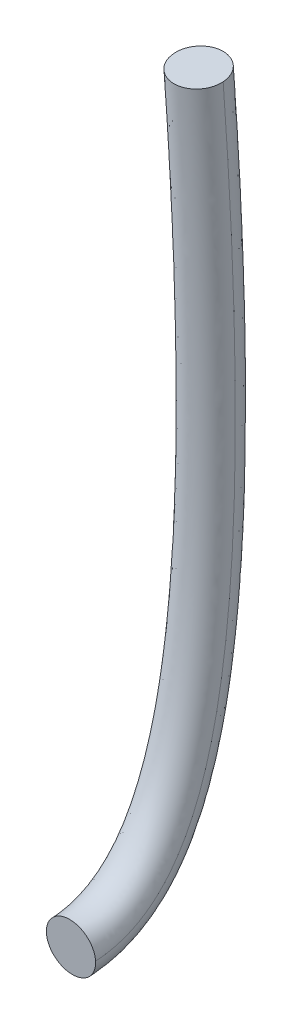
ISO-10303-21;
HEADER;
FILE_DESCRIPTION(('STEP AP214'),'2;1');
FILE_NAME('part.step','',(''),(''),'','','');
FILE_SCHEMA(('AUTOMOTIVE_DESIGN { 1 0 10303 214 1 1 1 1 }'));
ENDSEC;
DATA;
#1=APPLICATION_CONTEXT('core data for automotive mechanical design processes');
#2=APPLICATION_PROTOCOL_DEFINITION('international standard','automotive_design',2000,#1);
#3=PRODUCT_CONTEXT('',#1,'mechanical');
#4=PRODUCT('Part','Part','',(#3));
#5=PRODUCT_RELATED_PRODUCT_CATEGORY('part','',(#4));
#6=PRODUCT_DEFINITION_FORMATION('','',#4);
#7=PRODUCT_DEFINITION_CONTEXT('part definition',#1,'design');
#8=PRODUCT_DEFINITION('design','',#6,#7);
#9=PRODUCT_DEFINITION_SHAPE('','',#8);
#10=(LENGTH_UNIT() NAMED_UNIT(*) SI_UNIT(.MILLI.,.METRE.));
#11=(NAMED_UNIT(*) PLANE_ANGLE_UNIT() SI_UNIT($,.RADIAN.));
#12=(NAMED_UNIT(*) SI_UNIT($,.STERADIAN.) SOLID_ANGLE_UNIT());
#13=UNCERTAINTY_MEASURE_WITH_UNIT(LENGTH_MEASURE(1.E-05),#10,'distance_accuracy_value','');
#14=(GEOMETRIC_REPRESENTATION_CONTEXT(3) GLOBAL_UNCERTAINTY_ASSIGNED_CONTEXT((#13)) GLOBAL_UNIT_ASSIGNED_CONTEXT((#10,
#11,#12)) REPRESENTATION_CONTEXT('',''));
#15=CARTESIAN_POINT('',(0.,0.,0.));
#16=DIRECTION('',(0.,0.,1.));
#17=DIRECTION('',(1.,0.,0.));
#18=AXIS2_PLACEMENT_3D('',#15,#16,#17);
#19=CARTESIAN_POINT('',(7.845,-7.38568943191456,11.1672900449514));
#20=CARTESIAN_POINT('',(7.84499999999991,-7.3810594674981,11.0833632476063));
#21=CARTESIAN_POINT('',(7.84499999999976,-7.35133772082047,10.9233015622684));
#22=CARTESIAN_POINT('',(7.84499999999962,-7.20868869492565,10.6348630581117));
#23=CARTESIAN_POINT('',(7.84499999999973,-6.87046613629315,10.3352095257699));
#24=CARTESIAN_POINT('',(7.84500000000011,-6.18721074057805,10.0812554270995));
#25=CARTESIAN_POINT('',(7.84500000000061,-5.06636812071888,9.90824569486019));
#26=CARTESIAN_POINT('',(7.84500000000091,-3.38096738006171,9.8645311512753));
#27=CARTESIAN_POINT('',(7.84500000000045,-1.83527381521949,9.93899557759439));
#28=CARTESIAN_POINT('',(7.845,-1.00000001490137,10.0000001490162));
#29=CARTESIAN_POINT('',(7.84500000000102,-7.43610265920569,11.1645089135862));
#30=CARTESIAN_POINT('',(7.84500000000093,-7.43123996642441,11.0763634777044));
#31=CARTESIAN_POINT('',(7.84500000000078,-7.40000815174358,10.9073160171067));
#32=CARTESIAN_POINT('',(7.84500000000064,-7.24856642332976,10.6012824291832));
#33=CARTESIAN_POINT('',(7.84500000000075,-6.89400338386197,10.2891862726741));
#34=CARTESIAN_POINT('',(7.84500000000113,-6.19817270202607,10.0316631862401));
#35=CARTESIAN_POINT('',(7.84500000000163,-5.0694612340294,9.85763518272215));
#36=CARTESIAN_POINT('',(7.84500000000193,-3.37984553891513,9.81402063425969));
#37=CARTESIAN_POINT('',(7.84500000000147,-1.8323873202791,9.8885820302603));
#38=CARTESIAN_POINT('',(7.84500000000102,-0.996322261093758,9.94964439160444));
#39=CARTESIAN_POINT('',(7.8213230241062,-7.50284933441553,11.1608267198065));
#40=CARTESIAN_POINT('',(7.82132302410611,-7.49768322648806,11.0671813147682));
#41=CARTESIAN_POINT('',(7.82132302410596,-7.46438212052614,10.8862786552973));
#42=CARTESIAN_POINT('',(7.82132302410583,-7.30142109147906,10.557213644209));
#43=CARTESIAN_POINT('',(7.82132302410594,-6.92526844906694,10.2286049543992));
#44=CARTESIAN_POINT('',(7.82132302410632,-6.21284698493529,9.96624121141034));
#45=CARTESIAN_POINT('',(7.82132302410682,-5.07366826959445,9.79076055574375));
#46=CARTESIAN_POINT('',(7.82132302410711,-3.37847011854963,9.7472167872483));
#47=CARTESIAN_POINT('',(7.82132302410666,-1.82854959475709,9.82183610216784));
#48=CARTESIAN_POINT('',(7.82132302410621,-0.991452946985371,9.88297380601593));
#49=CARTESIAN_POINT('',(7.72584022145776,-7.59922087533285,11.1555102199601));
#50=CARTESIAN_POINT('',(7.72584022145766,-7.59361164415277,11.0538323740483));
#51=CARTESIAN_POINT('',(7.72584022145752,-7.55739761006004,10.8557679232225));
#52=CARTESIAN_POINT('',(7.72584022145738,-7.37767396793035,10.4931666791485));
#53=CARTESIAN_POINT('',(7.7258402214575,-6.97030122882817,10.1407577962855));
#54=CARTESIAN_POINT('',(7.72584022145788,-6.23386248441176,9.87152821745463));
#55=CARTESIAN_POINT('',(7.72584022145838,-5.07962307116528,9.69406183551335));
#56=CARTESIAN_POINT('',(7.72584022145867,-3.37636676847043,9.6506861219817));
#57=CARTESIAN_POINT('',(7.72584022145821,-1.82302566831393,9.72546438840435));
#58=CARTESIAN_POINT('',(7.72584022145776,-0.984422434943267,9.78671212636189));
#59=CARTESIAN_POINT('',(7.56290282585875,-7.63627859669514,11.1534658677784));
#60=CARTESIAN_POINT('',(7.56290282585866,-7.63050054429366,11.0487278202834));
#61=CARTESIAN_POINT('',(7.56290282585851,-7.59314306154008,10.8440781237117));
#62=CARTESIAN_POINT('',(7.56290282585838,-7.40701444564064,10.4686693685656));
#63=CARTESIAN_POINT('',(7.5629028258585,-6.98765167944679,10.1070957261486));
#64=CARTESIAN_POINT('',(7.56290282585887,-6.24199718663417,9.83518755304667));
#65=CARTESIAN_POINT('',(7.56290282585938,-5.08195015573207,9.65692275251784));
#66=CARTESIAN_POINT('',(7.56290282585967,-3.37559462287614,9.61359110906464));
#67=CARTESIAN_POINT('',(7.56290282585922,-1.82089620691281,9.68840699113651));
#68=CARTESIAN_POINT('',(7.56290282585877,-0.98171899413694,9.74969664992002));
#69=CARTESIAN_POINT('',(7.38777687516913,-7.49738858096694,11.161127971552));
#70=CARTESIAN_POINT('',(7.38777687516904,-7.4922465589224,11.06791916836));
#71=CARTESIAN_POINT('',(7.38777687516889,-7.45912569211774,10.8879798681174));
#72=CARTESIAN_POINT('',(7.38777687516876,-7.29708798693661,10.5607577906464));
#73=CARTESIAN_POINT('',(7.38777687516887,-6.9226946111011,10.2335060807567));
#74=CARTESIAN_POINT('',(7.38777687516925,-6.21162129621653,9.97155640735105));
#75=CARTESIAN_POINT('',(7.38777687516975,-5.07330659645134,9.79621093676382));
#76=CARTESIAN_POINT('',(7.38777687517004,-3.37856545955663,9.75267101376723));
#77=CARTESIAN_POINT('',(7.38777687516958,-1.82886607833171,9.82729661137127));
#78=CARTESIAN_POINT('',(7.38777687516913,-0.991851320743193,9.88842833433557));
#79=CARTESIAN_POINT('',(7.3879994399954,-7.34844389980353,11.1693447580328));
#80=CARTESIAN_POINT('',(7.38799943999531,-7.34398459798221,11.0885115406259));
#81=CARTESIAN_POINT('',(7.38799943999516,-7.31539746588993,10.9350772330637));
#82=CARTESIAN_POINT('',(7.38799943999502,-7.17921141409529,10.6595664080425));
#83=CARTESIAN_POINT('',(7.38799943999513,-6.85304906745349,10.3691160114705));
#84=CARTESIAN_POINT('',(7.38799943999551,-6.1790684164345,10.1178299672486));
#85=CARTESIAN_POINT('',(7.38799943999601,-5.06405261164205,9.94560085911794));
#86=CARTESIAN_POINT('',(7.3879994399963,-3.3817664125075,9.90182914108563));
#87=CARTESIAN_POINT('',(7.38799943999584,-1.83741071728909,9.97624102875169));
#88=CARTESIAN_POINT('',(7.3879994399954,-1.00271715690776,10.0372032221069));
#89=CARTESIAN_POINT('',(7.41712336251966,-7.28809487388892,11.1726740146158));
#90=CARTESIAN_POINT('',(7.41712336251957,-7.28391219096522,11.0968550340527));
#91=CARTESIAN_POINT('',(7.41712336251942,-7.25716208441642,10.9541599167949));
#92=CARTESIAN_POINT('',(7.41712336251929,-7.13145043749268,10.6996011042162));
#93=CARTESIAN_POINT('',(7.4171233625194,-6.82483017855781,10.4240618021488));
#94=CARTESIAN_POINT('',(7.41712336251977,-6.16587858931999,10.1770965163929));
#95=CARTESIAN_POINT('',(7.41712336252028,-5.06030301226849,10.0061301753601));
#96=CARTESIAN_POINT('',(7.41712336252057,-3.38306327462149,9.96226459069808));
#97=CARTESIAN_POINT('',(7.41712336252011,-1.84087282569988,10.0365899468089));
#98=CARTESIAN_POINT('',(7.41712336251966,-1.00711974868314,10.0974834515681));
#99=B_SPLINE_SURFACE_WITH_KNOTS('',3,3,((#19,#20,#21,#22,#23,#24,#25,#26,#27,#28),(#29,#30,#31,
#32,#33,#34,#35,#36,#37,#38),(#39,#40,#41,#42,#43,#44,#45,#46,#47,#48),(#49,#50,#51,#52,#53,#54,
#55,#56,#57,#58),(#59,#60,#61,#62,#63,#64,#65,#66,#67,#68),(#69,#70,#71,#72,#73,#74,#75,#76,#77,
#78),(#79,#80,#81,#82,#83,#84,#85,#86,#87,#88),(#89,#90,#91,#92,#93,#94,#95,#96,#97,#98)),
.UNSPECIFIED.,.F.,.F.,.F.,(4,1,1,1,1,4),(4,1,1,1,1,1,1,4),(-3.14159265358979,-2.46839422782055,
-2.24399475256414,-1.34639685153848,-0.448798950512828,0.448798950512828),(0.,
0.0714285714285714,0.142857142857143,0.285714285714286,0.428571428571429,0.571428571428571,
0.785714285714286,1.),.UNSPECIFIED.);
#100=CARTESIAN_POINT('',(7.845,-7.38568943191456,11.1672900449514));
#101=CARTESIAN_POINT('',(7.84499999999991,-7.3810594674981,11.0833632476063));
#102=CARTESIAN_POINT('',(7.84499999999976,-7.35133772082047,10.9233015622684));
#103=CARTESIAN_POINT('',(7.84499999999962,-7.20868869492565,10.6348630581117));
#104=CARTESIAN_POINT('',(7.84499999999973,-6.87046613629315,10.3352095257699));
#105=CARTESIAN_POINT('',(7.84500000000011,-6.18721074057805,10.0812554270995));
#106=CARTESIAN_POINT('',(7.84500000000061,-5.06636812071888,9.90824569486019));
#107=CARTESIAN_POINT('',(7.84500000000091,-3.38096738006171,9.8645311512753));
#108=CARTESIAN_POINT('',(7.84500000000045,-1.83527381521949,9.93899557759439));
#109=CARTESIAN_POINT('',(7.845,-1.00000001490137,10.0000001490162));
#110=B_SPLINE_CURVE_WITH_KNOTS('',3,(#100,#101,#102,#103,#104,#105,#106,#107,#108,#109),
.UNSPECIFIED.,.F.,.F.,(4,1,1,1,1,1,1,4),(0.,0.0714285714285714,0.142857142857143,
0.285714285714286,0.428571428571429,0.571428571428571,0.785714285714286,1.),.UNSPECIFIED.);
#111=CARTESIAN_POINT('',(7.845,-7.38568943191456,11.1672900449514));
#112=VERTEX_POINT('',#111);
#113=CARTESIAN_POINT('',(7.845,-1.00000001490137,10.0000001490162));
#114=VERTEX_POINT('',#113);
#115=EDGE_CURVE('E11',#112,#114,#110,.T.);
#116=CARTESIAN_POINT('',(7.845,-7.38568943191456,11.1672900449514));
#117=CARTESIAN_POINT('',(7.84499099936549,-7.39838143308749,11.1665898691355));
#118=CARTESIAN_POINT('',(7.84386907703709,-7.41108343198157,11.1658891417784));
#119=CARTESIAN_POINT('',(7.83948816505506,-7.43612991695903,11.1645074098659));
#120=CARTESIAN_POINT('',(7.83622488035257,-7.44847363234333,11.1638264478275));
#121=CARTESIAN_POINT('',(7.82772050711996,-7.47243399401068,11.1625046337534));
#122=CARTESIAN_POINT('',(7.82248342940231,-7.48405205939962,11.1618637034304));
#123=CARTESIAN_POINT('',(7.81016527969654,-7.50626096383781,11.1606385114711));
#124=CARTESIAN_POINT('',(7.80308527554079,-7.5168523928817,11.1600542172868));
#125=CARTESIAN_POINT('',(7.7871070635714,-7.53685620668327,11.1589506729003));
#126=CARTESIAN_POINT('',(7.77818157773625,-7.54624701604749,11.1584326129412));
#127=CARTESIAN_POINT('',(7.7587812418423,-7.56326115701625,11.1574939989377));
#128=CARTESIAN_POINT('',(7.74830726206972,-7.57088547528674,11.1570733904621));
#129=CARTESIAN_POINT('',(7.7267837372992,-7.58382312050142,11.1563596632752));
#130=CARTESIAN_POINT('',(7.71579491711388,-7.5892382212688,11.1560609300379));
#131=CARTESIAN_POINT('',(7.69308980154159,-7.59827862400274,11.1555622008562));
#132=CARTESIAN_POINT('',(7.68137262271155,-7.60190170274684,11.1553623275595));
#133=CARTESIAN_POINT('',(7.65685068331824,-7.6074298452763,11.1550573581813));
#134=CARTESIAN_POINT('',(7.64402167116172,-7.60922822727855,11.1549581473818));
#135=CARTESIAN_POINT('',(7.6182544646805,-7.61065844937608,11.1548792467489));
#136=CARTESIAN_POINT('',(7.60531643307436,-7.61029308928923,11.154899402459));
#137=CARTESIAN_POINT('',(7.57974035588276,-7.60726997827412,11.1550661775162));
#138=CARTESIAN_POINT('',(7.5671015798204,-7.604618567894,11.1552124470763));
#139=CARTESIAN_POINT('',(7.54250553903045,-7.59709028288686,11.1556277577137));
#140=CARTESIAN_POINT('',(7.53054866206545,-7.59221215595433,11.1558968678766));
#141=CARTESIAN_POINT('',(7.50820785574523,-7.58083372805158,11.1565245781905));
#142=CARTESIAN_POINT('',(7.49777489329327,-7.57442832629135,11.1568779430653));
#143=CARTESIAN_POINT('',(7.47802544398122,-7.56007561287903,11.1576697348944));
#144=CARTESIAN_POINT('',(7.46870960375714,-7.55212741509683,11.1581082107336));
#145=CARTESIAN_POINT('',(7.4507805541399,-7.53421251006557,11.1590965169176));
#146=CARTESIAN_POINT('',(7.44227377178441,-7.52413860526761,11.1596522609974));
#147=CARTESIAN_POINT('',(7.42719182272323,-7.50266809659722,11.1608367180992));
#148=CARTESIAN_POINT('',(7.42061371883068,-7.4912735412641,11.1614653181102));
#149=CARTESIAN_POINT('',(7.4048702762178,-7.456822200751,11.1633658848626));
#150=CARTESIAN_POINT('',(7.39857690117864,-7.43237780088633,11.1647144017265));
#151=CARTESIAN_POINT('',(7.39507383138844,-7.39527019971377,11.1667615056129));
#152=CARTESIAN_POINT('',(7.39491073731864,-7.38276049923189,11.1674516245013));
#153=CARTESIAN_POINT('',(7.39657661449667,-7.35785959497085,11.1688253252061));
#154=CARTESIAN_POINT('',(7.39840449678146,-7.3454683301511,11.1695089103899));
#155=CARTESIAN_POINT('',(7.40421280721926,-7.3205397773051,11.1708841363759));
#156=CARTESIAN_POINT('',(7.40829611973981,-7.30802607025692,11.1715744762934));
#157=CARTESIAN_POINT('',(7.41871945602452,-7.28397621510439,11.1729012274277));
#158=CARTESIAN_POINT('',(7.42505811825102,-7.27243948239868,11.173537670895));
#159=CARTESIAN_POINT('',(7.43915847468511,-7.2514747114763,11.1746942281143));
#160=CARTESIAN_POINT('',(7.44678462257932,-7.241954610055,11.1752194206896));
#161=CARTESIAN_POINT('',(7.46344583726369,-7.22421623708068,11.1761979881826));
#162=CARTESIAN_POINT('',(7.47248270377565,-7.21599965586831,11.1766512698499));
#163=CARTESIAN_POINT('',(7.49229721208537,-7.20061785813574,11.1774998328645));
#164=CARTESIAN_POINT('',(7.50314649049126,-7.19354444917039,11.177890049492));
#165=CARTESIAN_POINT('',(7.52586266071936,-7.18130654153279,11.1785651744662));
#166=CARTESIAN_POINT('',(7.53772814382777,-7.17613945135741,11.1788502257775));
#167=CARTESIAN_POINT('',(7.5621968865616,-7.16798878795635,11.1792998709768));
#168=CARTESIAN_POINT('',(7.57480019630874,-7.16500536325678,11.179464456671));
#169=CARTESIAN_POINT('',(7.60034533783806,-7.16133291751397,11.179667053382));
#170=CARTESIAN_POINT('',(7.61328748510116,-7.160646117329,11.1797049418814));
#171=CARTESIAN_POINT('',(7.63846570021675,-7.16143824032907,11.1796612430698));
#172=CARTESIAN_POINT('',(7.65070545112042,-7.16281329042796,11.1795853860941));
#173=CARTESIAN_POINT('',(7.67480514677498,-7.16748669545434,11.179327569763));
#174=CARTESIAN_POINT('',(7.68666533769148,-7.17078377603299,11.1791456807091));
#175=CARTESIAN_POINT('',(7.71023771848537,-7.1794842037233,11.1786657068284));
#176=CARTESIAN_POINT('',(7.7219157011262,-7.18498074477382,11.1783624807995));
#177=CARTESIAN_POINT('',(7.74414223558698,-7.19791687566722,11.1776488371527));
#178=CARTESIAN_POINT('',(7.7546901462053,-7.20535756046826,11.1772383591295));
#179=CARTESIAN_POINT('',(7.77415159390446,-7.22169366812527,11.1763371499859));
#180=CARTESIAN_POINT('',(7.78309826076089,-7.23054992289567,11.1758485796396));
#181=CARTESIAN_POINT('',(7.79942138560578,-7.24960390927147,11.1747974340973));
#182=CARTESIAN_POINT('',(7.80679829404541,-7.2598012546805,11.1742348802064));
#183=CARTESIAN_POINT('',(7.81984452666176,-7.28152038250541,11.1730367076064));
#184=CARTESIAN_POINT('',(7.82547590008455,-7.29306496053313,11.1723998313385));
#185=CARTESIAN_POINT('',(7.83464844733389,-7.3169454559651,11.1710824232211));
#186=CARTESIAN_POINT('',(7.83819132119967,-7.32928072065561,11.1704019273795));
#187=CARTESIAN_POINT('',(7.84210726412072,-7.34903662105252,11.1693120595573));
#188=CARTESIAN_POINT('',(7.84318733611661,-7.35632581814247,11.1689099386112));
#189=CARTESIAN_POINT('',(7.84463615326223,-7.37097205478329,11.1681019540743));
#190=CARTESIAN_POINT('',(7.84500521966528,-7.37832906218494,11.1676960922571));
#191=CARTESIAN_POINT('',(7.845,-7.38568943191456,11.1672900449514));
#192=B_SPLINE_CURVE_WITH_KNOTS('',3,(#116,#117,#118,#119,#120,#121,#122,#123,#124,#125,#126,
#127,#128,#129,#130,#131,#132,#133,#134,#135,#136,#137,#138,#139,#140,#141,#142,#143,#144,#145,
#146,#147,#148,#149,#150,#151,#152,#153,#154,#155,#156,#157,#158,#159,#160,#161,#162,#163,#164,
#165,#166,#167,#168,#169,#170,#171,#172,#173,#174,#175,#176,#177,#178,#179,#180,#181,#182,#183,
#184,#185,#186,#187,#188,#189,#190,#191),.UNSPECIFIED.,.T.,.F.,(4,2,2,2,2,2,2,2,2,2,2,2,2,2,2,2,
2,2,2,2,2,2,2,2,2,2,2,2,2,2,2,2,2,2,2,2,2,4),(0.,0.0381071198878035,0.0762909079253058,
0.114397519963521,0.152482101147101,0.191176017541725,0.22984826923352,0.266452628884145,
0.303102287520447,0.3417889744023,0.380425612809802,0.418955432797516,0.457506948706957,
0.494101793894292,0.530717720458362,0.570102934209955,0.609427852860273,0.683596680807129,
0.721077607324684,0.758538043966807,0.797868208445446,0.837174669772218,0.873647223663284,
0.910166693444929,0.948861997200893,0.987504501937375,1.02614963477256,1.06483212703772,
1.10163020624672,1.1384039152176,1.17693638689319,1.21549060733687,1.25312019600418,
1.2907389720403,1.3291260337164,1.36748180501112,1.38959095117446,1.41169010542788),.UNSPECIFIED.);
#193=CARTESIAN_POINT('',(7.41712336251966,-7.28809487388892,11.1726740146157));
#194=VERTEX_POINT('',#193);
#195=EDGE_CURVE('E47',#112,#194,#192,.T.);
#196=CARTESIAN_POINT('',(7.41712336251966,-7.28809487388892,11.1726740146158));
#197=CARTESIAN_POINT('',(7.41712336251957,-7.28391219096522,11.0968550340527));
#198=CARTESIAN_POINT('',(7.41712336251942,-7.25716208441642,10.9541599167949));
#199=CARTESIAN_POINT('',(7.41712336251929,-7.13145043749268,10.6996011042162));
#200=CARTESIAN_POINT('',(7.4171233625194,-6.82483017855781,10.4240618021488));
#201=CARTESIAN_POINT('',(7.41712336251977,-6.16587858931999,10.1770965163929));
#202=CARTESIAN_POINT('',(7.41712336252028,-5.06030301226849,10.0061301753601));
#203=CARTESIAN_POINT('',(7.41712336252057,-3.38306327462149,9.96226459069808));
#204=CARTESIAN_POINT('',(7.41712336252011,-1.84087282569988,10.0365899468089));
#205=CARTESIAN_POINT('',(7.41712336251966,-1.00711974868314,10.0974834515681));
#206=B_SPLINE_CURVE_WITH_KNOTS('',3,(#196,#197,#198,#199,#200,#201,#202,#203,#204,#205),
.UNSPECIFIED.,.F.,.F.,(4,1,1,1,1,1,1,4),(0.,0.0714285714285714,0.142857142857143,
0.285714285714286,0.428571428571429,0.571428571428571,0.785714285714286,1.),.UNSPECIFIED.);
#207=CARTESIAN_POINT('',(7.41712336251966,-1.00711974868314,10.0974834515681));
#208=VERTEX_POINT('',#207);
#209=EDGE_CURVE('E29',#194,#208,#206,.T.);
#210=CARTESIAN_POINT('',(7.845,-1.00000001490137,10.0000001490162));
#211=CARTESIAN_POINT('',(7.84501317593806,-1.00091767228433,10.0125647019962));
#212=CARTESIAN_POINT('',(7.84393574759237,-1.00183517933364,10.0251271966099));
#213=CARTESIAN_POINT('',(7.83973365090151,-1.00364587141142,10.0499191690435));
#214=CARTESIAN_POINT('',(7.83660681625396,-1.00453902966054,10.0621482802009));
#215=CARTESIAN_POINT('',(7.82832211513364,-1.00627464341825,10.0859122812502));
#216=CARTESIAN_POINT('',(7.82316358105131,-1.00711708215557,10.0974469415102));
#217=CARTESIAN_POINT('',(7.81093575269779,-1.00872463946805,10.1194575953731));
#218=CARTESIAN_POINT('',(7.80386645222267,-1.00948975779215,10.1299335855385));
#219=CARTESIAN_POINT('',(7.7881808387846,-1.01091680662578,10.1494727196512));
#220=CARTESIAN_POINT('',(7.77958178446605,-1.0115797483386,10.1585497089808));
#221=CARTESIAN_POINT('',(7.76102444038904,-1.01279524851314,10.1751923215983));
#222=CARTESIAN_POINT('',(7.75106662276773,-1.01334784515351,10.1827584676277));
#223=CARTESIAN_POINT('',(7.72971656152981,-1.01433872591174,10.1963255941117));
#224=CARTESIAN_POINT('',(7.71829113232454,-1.0147732367601,10.2022749110092));
#225=CARTESIAN_POINT('',(7.69457290265436,-1.01549125157821,10.2121059605818));
#226=CARTESIAN_POINT('',(7.68227954718061,-1.01577465791307,10.2159863564411));
#227=CARTESIAN_POINT('',(7.65749382693608,-1.016183971958,10.2215906790329));
#228=CARTESIAN_POINT('',(7.64501157621839,-1.01631316526939,10.2233595921759));
#229=CARTESIAN_POINT('',(7.61992988023037,-1.01642111456128,10.2248376324795));
#230=CARTESIAN_POINT('',(7.60733052426643,-1.01639997707101,10.224548218237));
#231=CARTESIAN_POINT('',(7.58212614123041,-1.01619857032895,10.221790559738));
#232=CARTESIAN_POINT('',(7.56952547347359,-1.01601531253878,10.2192813964527));
#233=CARTESIAN_POINT('',(7.54497730519842,-1.01548792543046,10.2120604190088));
#234=CARTESIAN_POINT('',(7.53302993615891,-1.01514376386195,10.2073481632785));
#235=CARTESIAN_POINT('',(7.51058009652881,-1.01433323370056,10.196250394826));
#236=CARTESIAN_POINT('',(7.50003792437722,-1.01387263624949,10.1899439005025));
#237=CARTESIAN_POINT('',(7.48006162914826,-1.0128370085628,10.1757640996543));
#238=CARTESIAN_POINT('',(7.47062835212084,-1.0122618918425,10.1678896089827));
#239=CARTESIAN_POINT('',(7.45250157527696,-1.01096652328919,10.1501534395592));
#240=CARTESIAN_POINT('',(7.44390612406106,-1.0102389287804,10.1401912249858));
#241=CARTESIAN_POINT('',(7.42861370115921,-1.00868675931246,10.1189389407715));
#242=CARTESIAN_POINT('',(7.42191381886624,-1.00786233581749,10.1076509449759));
#243=CARTESIAN_POINT('',(7.4057125283789,-1.00535581172261,10.0733316495931));
#244=CARTESIAN_POINT('',(7.39910115047677,-1.0035685372167,10.0488603102497));
#245=CARTESIAN_POINT('',(7.39518661715354,-1.00085477060905,10.0117034530712));
#246=CARTESIAN_POINT('',(7.39489032696615,-0.999941948577231,9.99920510565618));
#247=CARTESIAN_POINT('',(7.39629288921267,-0.998123368471668,9.97430513044851));
#248=CARTESIAN_POINT('',(7.39799075655713,-0.997217607132445,9.96190345794495));
#249=CARTESIAN_POINT('',(7.40353873163258,-0.995394354859906,9.93693951148772));
#250=CARTESIAN_POINT('',(7.40749083142287,-0.994478487619715,9.92439946911925));
#251=CARTESIAN_POINT('',(7.4176663947997,-0.992716588496242,9.90027556918292));
#252=CARTESIAN_POINT('',(7.42388823091449,-0.991870507105972,9.88869103376606));
#253=CARTESIAN_POINT('',(7.43776747707169,-0.990334121804168,9.86765486614983));
#254=CARTESIAN_POINT('',(7.44528234559601,-0.989636895307395,9.85810845000321));
#255=CARTESIAN_POINT('',(7.46172553467917,-0.988335926094833,9.84029559642616));
#256=CARTESIAN_POINT('',(7.47065577757634,-0.987732312761387,9.8320309304971));
#257=CARTESIAN_POINT('',(7.49026760777657,-0.986599206282035,9.81651645128502));
#258=CARTESIAN_POINT('',(7.50102262529526,-0.986076442207981,9.8093587723665));
#259=CARTESIAN_POINT('',(7.52356361106553,-0.985168522382637,9.79692754589912));
#260=CARTESIAN_POINT('',(7.53534820771803,-0.984783186927519,9.79165153784778));
#261=CARTESIAN_POINT('',(7.55972520258139,-0.984169226492469,9.78324519953794));
#262=CARTESIAN_POINT('',(7.57232065893654,-0.983941237990559,9.78012358392825));
#263=CARTESIAN_POINT('',(7.59787201531912,-0.98365516174762,9.77620663172221));
#264=CARTESIAN_POINT('',(7.61082810233621,-0.983597163869312,9.77541252552508));
#265=CARTESIAN_POINT('',(7.63594604438667,-0.983639713687138,9.77599511707882));
#266=CARTESIAN_POINT('',(7.64811128899319,-0.983731460336026,9.777251311005));
#267=CARTESIAN_POINT('',(7.67210276191912,-0.984051759997005,9.78163684980712));
#268=CARTESIAN_POINT('',(7.68392882083022,-0.984280380166114,9.7847671141961));
#269=CARTESIAN_POINT('',(7.70779022260617,-0.984891254956927,9.79313120390543));
#270=CARTESIAN_POINT('',(7.71977799536472,-0.985283492831905,9.79850171980009));
#271=CARTESIAN_POINT('',(7.74261084104115,-0.986214049124153,9.81124288447892));
#272=CARTESIAN_POINT('',(7.75345728937329,-0.986752188849876,9.81861108662076));
#273=CARTESIAN_POINT('',(7.78278287795126,-0.988518149737747,9.84279060018279));
#274=CARTESIAN_POINT('',(7.7992567550773,-0.989928685834919,9.86210364212244));
#275=CARTESIAN_POINT('',(7.82506945817775,-0.993050098402343,9.90484198249267));
#276=CARTESIAN_POINT('',(7.83443174830103,-0.994759964074616,9.92825344109044));
#277=CARTESIAN_POINT('',(7.84321018372584,-0.997670686675512,9.96810701717283));
#278=CARTESIAN_POINT('',(7.84498327921999,-0.998835471841611,9.98405524055302));
#279=CARTESIAN_POINT('',(7.845,-1.00000001490137,10.0000001490162));
#280=B_SPLINE_CURVE_WITH_KNOTS('',3,(#210,#211,#212,#213,#214,#215,#216,#217,#218,#219,#220,
#221,#222,#223,#224,#225,#226,#227,#228,#229,#230,#231,#232,#233,#234,#235,#236,#237,#238,#239,
#240,#241,#242,#243,#244,#245,#246,#247,#248,#249,#250,#251,#252,#253,#254,#255,#256,#257,#258,
#259,#260,#261,#262,#263,#264,#265,#266,#267,#268,#269,#270,#271,#272,#273,#274,#275,#276,#277,
#278,#279),.UNSPECIFIED.,.T.,.F.,(4,2,2,2,2,2,2,2,2,2,2,2,2,2,2,2,2,2,2,2,2,2,2,2,2,2,2,2,2,2,2,
2,2,2,4),(0.,0.0377492486610547,0.0755384642427686,0.113340107606873,0.151141873708151,
0.188541470911546,0.225928105603193,0.264397285071446,0.30289129104093,0.340549623316576,
0.378181272347947,0.416521425986161,0.454869267538883,0.491598549092431,0.528355674434288,
0.567686532370582,0.606956666705898,0.681504092331086,0.719000956041075,0.756479304546763,
0.79580558597537,0.835103724480756,0.871456565869654,0.907859211009021,0.946472970653827,
0.985036051596695,1.02375422242088,1.06249285727514,1.09903552900839,1.13559614512131,
1.17482150835164,1.21399904612317,1.28872782892463,1.36320896569526,1.41111423661185),.UNSPECIFIED.);
#281=EDGE_CURVE('E48',#208,#114,#280,.T.);
#282=ORIENTED_EDGE('',*,*,#115,.F.);
#283=ORIENTED_EDGE('',*,*,#195,.T.);
#284=ORIENTED_EDGE('',*,*,#209,.T.);
#285=ORIENTED_EDGE('',*,*,#281,.T.);
#286=EDGE_LOOP('',(#282,#283,#284,#285));
#287=FACE_BOUND('',#286,.T.);
#288=ADVANCED_FACE('F17',(#287),#99,.T.);
#289=CARTESIAN_POINT('',(7.62,-7.38568943191911,11.1672900449514));
#290=DIRECTION('',(-1.11249196396045E-12,0.0550829445172842,-0.998481782118886));
#291=DIRECTION('',(0.,0.998481782118886,0.0550829445172842));
#292=AXIS2_PLACEMENT_3D('',#289,#290,#291);
#293=PLANE('',#292);
#294=ORIENTED_EDGE('',*,*,#195,.F.);
#295=EDGE_CURVE('E50',#194,#112,#192,.T.);
#296=ORIENTED_EDGE('',*,*,#295,.F.);
#297=EDGE_LOOP('',(#294,#296));
#298=FACE_BOUND('',#297,.T.);
#299=ADVANCED_FACE('F54',(#298),#293,.F.);
#300=CARTESIAN_POINT('',(7.62,-1.00000001490116,10.0000001490116));
#301=DIRECTION('',(-5.32623886368089E-13,0.997343536648528,0.0728414024124084));
#302=DIRECTION('',(0.,-0.0728414024124084,0.997343536648528));
#303=AXIS2_PLACEMENT_3D('',#300,#301,#302);
#304=PLANE('',#303);
#305=EDGE_CURVE('E56',#114,#208,#280,.T.);
#306=ORIENTED_EDGE('',*,*,#305,.F.);
#307=ORIENTED_EDGE('',*,*,#281,.F.);
#308=EDGE_LOOP('',(#306,#307));
#309=FACE_BOUND('',#308,.T.);
#310=ADVANCED_FACE('F84',(#309),#304,.T.);
#311=CARTESIAN_POINT('',(7.41712336251966,-7.28809487388892,11.1726740146158));
#312=CARTESIAN_POINT('',(7.41712336251957,-7.28391219096522,11.0968550340527));
#313=CARTESIAN_POINT('',(7.41712336251942,-7.25716208441642,10.9541599167949));
#314=CARTESIAN_POINT('',(7.41712336251929,-7.13145043749268,10.6996011042162));
#315=CARTESIAN_POINT('',(7.4171233625194,-6.82483017855781,10.4240618021488));
#316=CARTESIAN_POINT('',(7.41712336251977,-6.16587858931999,10.1770965163929));
#317=CARTESIAN_POINT('',(7.41712336252028,-5.06030301226849,10.0061301753601));
#318=CARTESIAN_POINT('',(7.41712336252057,-3.38306327462149,9.96226459069808));
#319=CARTESIAN_POINT('',(7.41712336252011,-1.84087282569988,10.0365899468089));
#320=CARTESIAN_POINT('',(7.41712336251966,-1.00711974868314,10.0974834515681));
#321=CARTESIAN_POINT('',(7.44624728504393,-7.22774584797431,11.1760032711987));
#322=CARTESIAN_POINT('',(7.44624728504384,-7.22383978394823,11.1051985274795));
#323=CARTESIAN_POINT('',(7.44624728504369,-7.19892670294291,10.9732426005261));
#324=CARTESIAN_POINT('',(7.44624728504355,-7.08368946089006,10.7396358003898));
#325=CARTESIAN_POINT('',(7.44624728504366,-6.79661128966213,10.479007592827));
#326=CARTESIAN_POINT('',(7.44624728504404,-6.15268876220548,10.2363630655373));
#327=CARTESIAN_POINT('',(7.44624728504454,-5.05655341289494,10.0666594916023));
#328=CARTESIAN_POINT('',(7.44624728504483,-3.38436013673548,10.0227000403105));
#329=CARTESIAN_POINT('',(7.44624728504437,-1.84433493411067,10.096938864866));
#330=CARTESIAN_POINT('',(7.44624728504393,-1.01152234045852,10.1577636810294));
#331=CARTESIAN_POINT('',(7.54798626965588,-7.14685085329117,11.1804659810684));
#332=CARTESIAN_POINT('',(7.54798626965579,-7.14331557521144,11.1163824287406));
#333=CARTESIAN_POINT('',(7.54798626965564,-7.12086506573495,10.9988217992572));
#334=CARTESIAN_POINT('',(7.5479862696555,-7.01966804401707,10.793299696776));
#335=CARTESIAN_POINT('',(7.54798626965561,-6.75878502921892,10.5526591708264));
#336=CARTESIAN_POINT('',(7.54798626965598,-6.13500813711395,10.3158066226323));
#337=CARTESIAN_POINT('',(7.54798626965649,-5.05152705179564,10.1477959163901));
#338=CARTESIAN_POINT('',(7.54798626965678,-3.38609832030243,10.1037107525505));
#339=CARTESIAN_POINT('',(7.54798626965632,-1.84897575446072,10.1778337128583));
#340=CARTESIAN_POINT('',(7.54798626965588,-1.01742380502837,10.2385664573437));
#341=CARTESIAN_POINT('',(7.72547161608299,-7.16764359030081,11.179318914392));
#342=CARTESIAN_POINT('',(7.72547161608289,-7.16401268822835,11.1135019976718));
#343=CARTESIAN_POINT('',(7.72547161608274,-7.14093395673362,10.9922384534935));
#344=CARTESIAN_POINT('',(7.7254716160826,-7.03611984754312,10.779479727089));
#345=CARTESIAN_POINT('',(7.72547161608271,-6.7685007427605,10.5337043102432));
#346=CARTESIAN_POINT('',(7.72547161608309,-6.13954176046846,10.2953708448991));
#347=CARTESIAN_POINT('',(7.72547161608359,-5.05281142108461,10.1269320940004));
#348=CARTESIAN_POINT('',(7.72547161608388,-3.38564410214607,10.0828834176644));
#349=CARTESIAN_POINT('',(7.72547161608343,-1.84778399374474,10.1570409342111));
#350=CARTESIAN_POINT('',(7.72547161608298,-1.01590692995765,10.2177974235594));
#351=CARTESIAN_POINT('',(7.82594457644654,-7.26777381200591,11.1737950605315));
#352=CARTESIAN_POINT('',(7.82594457644644,-7.26368486066513,11.0996751408811));
#353=CARTESIAN_POINT('',(7.82594457644629,-7.23754461764378,10.9606013980745));
#354=CARTESIAN_POINT('',(7.82594457644615,-7.11537517687758,10.7131305648111));
#355=CARTESIAN_POINT('',(7.82594457644626,-6.81534084691086,10.4426074044024));
#356=CARTESIAN_POINT('',(7.82594457644664,-6.16145724500372,10.1970826708155));
#357=CARTESIAN_POINT('',(7.82594457644714,-5.05905433994462,10.0265285319981));
#358=CARTESIAN_POINT('',(7.82594457644744,-3.3835136394553,9.98262367084972));
#359=CARTESIAN_POINT('',(7.82594457644698,-1.84203661074678,10.0569111181142));
#360=CARTESIAN_POINT('',(7.82594457644653,-1.0086022140344,10.1177813479242));
#361=CARTESIAN_POINT('',(7.84499999999932,-7.35208061372048,11.1691441325282));
#362=CARTESIAN_POINT('',(7.84499999999923,-7.34760369485504,11.0879915731232));
#363=CARTESIAN_POINT('',(7.84499999999908,-7.31891992392266,10.9339016888528));
#364=CARTESIAN_POINT('',(7.84499999999894,-7.18207811949747,10.6570751476315));
#365=CARTESIAN_POINT('',(7.84499999999905,-6.85472908612469,10.3657339472071));
#366=CARTESIAN_POINT('',(7.84499999999943,-6.17983094897785,10.1142107097671));
#367=CARTESIAN_POINT('',(7.84499999999993,-5.0642561029733,9.94192650096782));
#368=CARTESIAN_POINT('',(7.84500000000023,-3.38166617764749,9.89817282182164));
#369=CARTESIAN_POINT('',(7.84499999999977,-1.83720530777412,9.97260408602737));
#370=CARTESIAN_POINT('',(7.84499999999932,-1.00245185077312,10.0335706539573));
#371=CARTESIAN_POINT('',(7.845,-7.38568943191456,11.1672900449514));
#372=CARTESIAN_POINT('',(7.84499999999991,-7.3810594674981,11.0833632476063));
#373=CARTESIAN_POINT('',(7.84499999999976,-7.35133772082047,10.9233015622684));
#374=CARTESIAN_POINT('',(7.84499999999962,-7.20868869492565,10.6348630581117));
#375=CARTESIAN_POINT('',(7.84499999999973,-6.87046613629315,10.3352095257699));
#376=CARTESIAN_POINT('',(7.84500000000011,-6.18721074057805,10.0812554270995));
#377=CARTESIAN_POINT('',(7.84500000000061,-5.06636812071888,9.90824569486019));
#378=CARTESIAN_POINT('',(7.84500000000091,-3.38096738006171,9.8645311512753));
#379=CARTESIAN_POINT('',(7.84500000000045,-1.83527381521949,9.93899557759439));
#380=CARTESIAN_POINT('',(7.845,-1.00000001490137,10.0000001490162));
#381=B_SPLINE_SURFACE_WITH_KNOTS('',3,3,((#311,#312,#313,#314,#315,#316,#317,#318,#319,#320),
(#321,#322,#323,#324,#325,#326,#327,#328,#329,#330),(#331,#332,#333,#334,#335,#336,#337,#338,
#339,#340),(#341,#342,#343,#344,#345,#346,#347,#348,#349,#350),(#351,#352,#353,#354,#355,#356,
#357,#358,#359,#360),(#361,#362,#363,#364,#365,#366,#367,#368,#369,#370),(#371,#372,#373,#374,
#375,#376,#377,#378,#379,#380)),.UNSPECIFIED.,.F.,.F.,.F.,(4,1,1,1,4),(4,1,1,1,1,1,1,4),
(0.448798950512828,1.34639685153848,2.01959527730772,2.69279370307697,3.14159265358979),(0.,
0.0714285714285714,0.142857142857143,0.285714285714286,0.428571428571429,0.571428571428571,
0.785714285714286,1.),.UNSPECIFIED.);
#382=ORIENTED_EDGE('',*,*,#295,.T.);
#383=ORIENTED_EDGE('',*,*,#115,.T.);
#384=ORIENTED_EDGE('',*,*,#305,.T.);
#385=ORIENTED_EDGE('',*,*,#209,.F.);
#386=EDGE_LOOP('',(#382,#383,#384,#385));
#387=FACE_BOUND('',#386,.T.);
#388=ADVANCED_FACE('F51',(#387),#381,.T.);
#389=CLOSED_SHELL('',(#288,#299,#310,#388));
#390=MANIFOLD_SOLID_BREP('B1',#389);
#391=ADVANCED_BREP_SHAPE_REPRESENTATION('',(#18,#390),#14);
#392=SHAPE_DEFINITION_REPRESENTATION(#9,#391);
ENDSEC;
END-ISO-10303-21;
